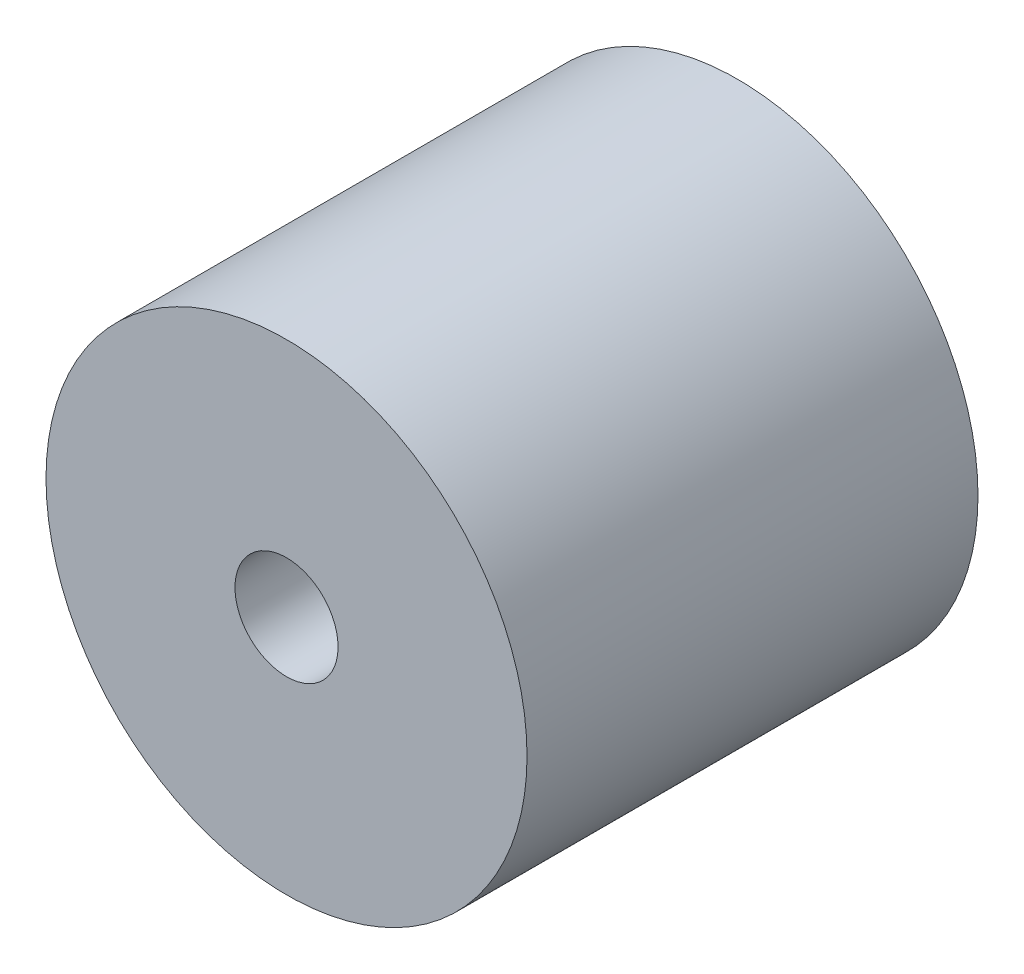
ISO-10303-21;
HEADER;
FILE_DESCRIPTION(('STEP AP214'),'2;1');
FILE_NAME('part.step','',(''),(''),'','','');
FILE_SCHEMA(('AUTOMOTIVE_DESIGN { 1 0 10303 214 1 1 1 1 }'));
ENDSEC;
DATA;
#1=APPLICATION_CONTEXT('core data for automotive mechanical design processes');
#2=APPLICATION_PROTOCOL_DEFINITION('international standard','automotive_design',2000,#1);
#3=PRODUCT_CONTEXT('',#1,'mechanical');
#4=PRODUCT('Part','Part','',(#3));
#5=PRODUCT_RELATED_PRODUCT_CATEGORY('part','',(#4));
#6=PRODUCT_DEFINITION_FORMATION('','',#4);
#7=PRODUCT_DEFINITION_CONTEXT('part definition',#1,'design');
#8=PRODUCT_DEFINITION('design','',#6,#7);
#9=PRODUCT_DEFINITION_SHAPE('','',#8);
#10=(LENGTH_UNIT() NAMED_UNIT(*) SI_UNIT(.MILLI.,.METRE.));
#11=(NAMED_UNIT(*) PLANE_ANGLE_UNIT() SI_UNIT($,.RADIAN.));
#12=(NAMED_UNIT(*) SI_UNIT($,.STERADIAN.) SOLID_ANGLE_UNIT());
#13=UNCERTAINTY_MEASURE_WITH_UNIT(LENGTH_MEASURE(1.E-05),#10,'distance_accuracy_value','');
#14=(GEOMETRIC_REPRESENTATION_CONTEXT(3) GLOBAL_UNCERTAINTY_ASSIGNED_CONTEXT((#13)) GLOBAL_UNIT_ASSIGNED_CONTEXT((#10,
#11,#12)) REPRESENTATION_CONTEXT('',''));
#15=CARTESIAN_POINT('',(0.,0.,0.));
#16=DIRECTION('',(0.,0.,1.));
#17=DIRECTION('',(1.,0.,0.));
#18=AXIS2_PLACEMENT_3D('',#15,#16,#17);
#19=CARTESIAN_POINT('',(0.,0.,30.));
#20=DIRECTION('',(0.,0.,1.));
#21=DIRECTION('',(1.,0.,0.));
#22=AXIS2_PLACEMENT_3D('',#19,#20,#21);
#23=PLANE('',#22);
#24=CARTESIAN_POINT('',(0.,0.,30.));
#25=DIRECTION('',(0.,0.,1.));
#26=DIRECTION('',(1.,0.,0.));
#27=AXIS2_PLACEMENT_3D('',#24,#25,#26);
#28=CIRCLE('',#27,16.);
#29=CARTESIAN_POINT('',(16.,0.,30.));
#30=VERTEX_POINT('',#29);
#31=EDGE_CURVE('E10',#30,#30,#28,.T.);
#32=ORIENTED_EDGE('',*,*,#31,.T.);
#33=EDGE_LOOP('',(#32));
#34=FACE_BOUND('',#33,.T.);
#35=CARTESIAN_POINT('',(0.,0.,30.));
#36=DIRECTION('',(0.,0.,1.));
#37=DIRECTION('',(1.,0.,0.));
#38=AXIS2_PLACEMENT_3D('',#35,#36,#37);
#39=CIRCLE('',#38,3.42952074105718);
#40=CARTESIAN_POINT('',(3.42952074105718,0.,30.));
#41=VERTEX_POINT('',#40);
#42=EDGE_CURVE('E50',#41,#41,#39,.T.);
#43=ORIENTED_EDGE('',*,*,#42,.F.);
#44=EDGE_LOOP('',(#43));
#45=FACE_BOUND('',#44,.T.);
#46=ADVANCED_FACE('F37',(#34,#45),#23,.T.);
#47=CARTESIAN_POINT('',(0.,0.,0.));
#48=DIRECTION('',(0.,0.,1.));
#49=DIRECTION('',(1.,0.,0.));
#50=AXIS2_PLACEMENT_3D('',#47,#48,#49);
#51=PLANE('',#50);
#52=CARTESIAN_POINT('',(0.,0.,0.));
#53=DIRECTION('',(0.,0.,1.));
#54=DIRECTION('',(1.,0.,0.));
#55=AXIS2_PLACEMENT_3D('',#52,#53,#54);
#56=CIRCLE('',#55,16.);
#57=CARTESIAN_POINT('',(16.,0.,0.));
#58=VERTEX_POINT('',#57);
#59=EDGE_CURVE('E41',#58,#58,#56,.T.);
#60=ORIENTED_EDGE('',*,*,#59,.F.);
#61=EDGE_LOOP('',(#60));
#62=FACE_BOUND('',#61,.T.);
#63=CARTESIAN_POINT('',(0.,0.,0.));
#64=DIRECTION('',(0.,0.,1.));
#65=DIRECTION('',(1.,0.,0.));
#66=AXIS2_PLACEMENT_3D('',#63,#64,#65);
#67=CIRCLE('',#66,3.42952074105718);
#68=CARTESIAN_POINT('',(3.42952074105718,0.,0.));
#69=VERTEX_POINT('',#68);
#70=EDGE_CURVE('E52',#69,#69,#67,.T.);
#71=ORIENTED_EDGE('',*,*,#70,.T.);
#72=EDGE_LOOP('',(#71));
#73=FACE_BOUND('',#72,.T.);
#74=ADVANCED_FACE('F64',(#62,#73),#51,.F.);
#75=CARTESIAN_POINT('',(0.,0.,30.));
#76=DIRECTION('',(0.,0.,-1.));
#77=DIRECTION('',(-1.,0.,0.));
#78=AXIS2_PLACEMENT_3D('',#75,#76,#77);
#79=CYLINDRICAL_SURFACE('',#78,16.);
#80=ORIENTED_EDGE('',*,*,#31,.F.);
#81=EDGE_LOOP('',(#80));
#82=FACE_BOUND('',#81,.T.);
#83=ORIENTED_EDGE('',*,*,#59,.T.);
#84=EDGE_LOOP('',(#83));
#85=FACE_BOUND('',#84,.T.);
#86=ADVANCED_FACE('F39',(#82,#85),#79,.T.);
#87=CARTESIAN_POINT('',(0.,0.,30.));
#88=DIRECTION('',(0.,0.,-1.));
#89=DIRECTION('',(-1.,0.,0.));
#90=AXIS2_PLACEMENT_3D('',#87,#88,#89);
#91=CYLINDRICAL_SURFACE('',#90,3.42952074105718);
#92=ORIENTED_EDGE('',*,*,#42,.T.);
#93=EDGE_LOOP('',(#92));
#94=FACE_BOUND('',#93,.T.);
#95=ORIENTED_EDGE('',*,*,#70,.F.);
#96=EDGE_LOOP('',(#95));
#97=FACE_BOUND('',#96,.T.);
#98=ADVANCED_FACE('F60',(#94,#97),#91,.F.);
#99=CLOSED_SHELL('',(#46,#74,#86,#98));
#100=MANIFOLD_SOLID_BREP('B2',#99);
#101=ADVANCED_BREP_SHAPE_REPRESENTATION('',(#18,#100),#14);
#102=SHAPE_DEFINITION_REPRESENTATION(#9,#101);
ENDSEC;
END-ISO-10303-21;
